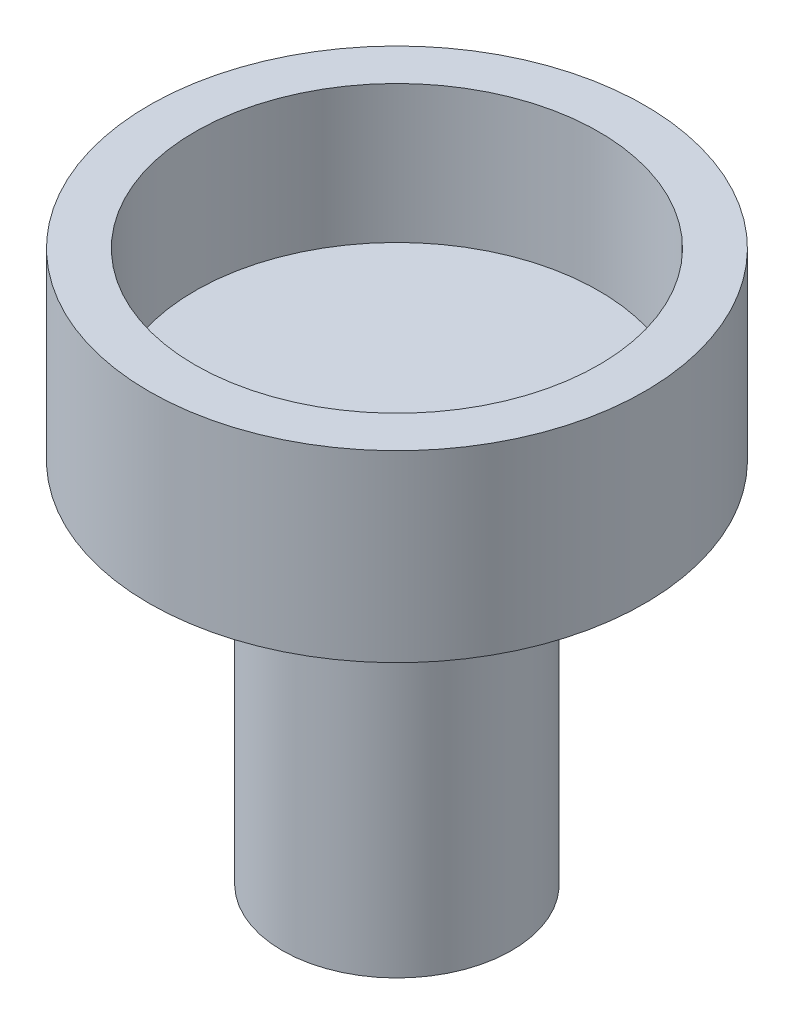
ISO-10303-21;
HEADER;
FILE_DESCRIPTION(('STEP AP214'),'2;1');
FILE_NAME('part.step','',(''),(''),'','','');
FILE_SCHEMA(('AUTOMOTIVE_DESIGN { 1 0 10303 214 1 1 1 1 }'));
ENDSEC;
DATA;
#1=APPLICATION_CONTEXT('core data for automotive mechanical design processes');
#2=APPLICATION_PROTOCOL_DEFINITION('international standard','automotive_design',2000,#1);
#3=PRODUCT_CONTEXT('',#1,'mechanical');
#4=PRODUCT('Part','Part','',(#3));
#5=PRODUCT_RELATED_PRODUCT_CATEGORY('part','',(#4));
#6=PRODUCT_DEFINITION_FORMATION('','',#4);
#7=PRODUCT_DEFINITION_CONTEXT('part definition',#1,'design');
#8=PRODUCT_DEFINITION('design','',#6,#7);
#9=PRODUCT_DEFINITION_SHAPE('','',#8);
#10=(LENGTH_UNIT() NAMED_UNIT(*) SI_UNIT(.MILLI.,.METRE.));
#11=(NAMED_UNIT(*) PLANE_ANGLE_UNIT() SI_UNIT($,.RADIAN.));
#12=(NAMED_UNIT(*) SI_UNIT($,.STERADIAN.) SOLID_ANGLE_UNIT());
#13=UNCERTAINTY_MEASURE_WITH_UNIT(LENGTH_MEASURE(1.E-05),#10,'distance_accuracy_value','');
#14=(GEOMETRIC_REPRESENTATION_CONTEXT(3) GLOBAL_UNCERTAINTY_ASSIGNED_CONTEXT((#13)) GLOBAL_UNIT_ASSIGNED_CONTEXT((#10,
#11,#12)) REPRESENTATION_CONTEXT('',''));
#15=CARTESIAN_POINT('',(0.,0.,0.));
#16=DIRECTION('',(0.,0.,1.));
#17=DIRECTION('',(1.,0.,0.));
#18=AXIS2_PLACEMENT_3D('',#15,#16,#17);
#19=CARTESIAN_POINT('',(0.,-4.,0.));
#20=DIRECTION('',(0.,1.,0.));
#21=DIRECTION('',(0.,0.,1.));
#22=AXIS2_PLACEMENT_3D('',#19,#20,#21);
#23=CYLINDRICAL_SURFACE('',#22,1.25);
#24=CARTESIAN_POINT('',(0.,-4.,0.));
#25=DIRECTION('',(0.,1.,0.));
#26=DIRECTION('',(0.,0.,1.));
#27=AXIS2_PLACEMENT_3D('',#24,#25,#26);
#28=CIRCLE('',#27,1.25);
#29=CARTESIAN_POINT('',(0.,-4.,1.25));
#30=VERTEX_POINT('',#29);
#31=EDGE_CURVE('E38',#30,#30,#28,.T.);
#32=ORIENTED_EDGE('',*,*,#31,.T.);
#33=EDGE_LOOP('',(#32));
#34=FACE_BOUND('',#33,.T.);
#35=CARTESIAN_POINT('',(0.,0.,0.));
#36=DIRECTION('',(0.,1.,0.));
#37=DIRECTION('',(0.,0.,1.));
#38=AXIS2_PLACEMENT_3D('',#35,#36,#37);
#39=CIRCLE('',#38,1.25);
#40=CARTESIAN_POINT('',(0.,0.,1.25));
#41=VERTEX_POINT('',#40);
#42=EDGE_CURVE('E42',#41,#41,#39,.T.);
#43=ORIENTED_EDGE('',*,*,#42,.F.);
#44=EDGE_LOOP('',(#43));
#45=FACE_BOUND('',#44,.T.);
#46=ADVANCED_FACE('F32',(#34,#45),#23,.T.);
#47=CARTESIAN_POINT('',(0.,-4.,0.));
#48=DIRECTION('',(0.,1.,0.));
#49=DIRECTION('',(0.,0.,1.));
#50=AXIS2_PLACEMENT_3D('',#47,#48,#49);
#51=PLANE('',#50);
#52=ORIENTED_EDGE('',*,*,#31,.F.);
#53=EDGE_LOOP('',(#52));
#54=FACE_BOUND('',#53,.T.);
#55=ADVANCED_FACE('F63',(#54),#51,.F.);
#56=CARTESIAN_POINT('',(0.,0.5,0.));
#57=DIRECTION('',(0.,-1.,0.));
#58=DIRECTION('',(0.,0.,-1.));
#59=AXIS2_PLACEMENT_3D('',#56,#57,#58);
#60=CYLINDRICAL_SURFACE('',#59,2.7);
#61=CARTESIAN_POINT('',(0.,0.,0.));
#62=DIRECTION('',(0.,1.,0.));
#63=DIRECTION('',(0.,0.,1.));
#64=AXIS2_PLACEMENT_3D('',#61,#62,#63);
#65=CIRCLE('',#64,2.7);
#66=CARTESIAN_POINT('',(0.,0.,2.7));
#67=VERTEX_POINT('',#66);
#68=EDGE_CURVE('E47',#67,#67,#65,.T.);
#69=ORIENTED_EDGE('',*,*,#68,.T.);
#70=EDGE_LOOP('',(#69));
#71=FACE_BOUND('',#70,.T.);
#72=CARTESIAN_POINT('',(0.,2.,0.));
#73=DIRECTION('',(0.,1.,0.));
#74=DIRECTION('',(0.,0.,1.));
#75=AXIS2_PLACEMENT_3D('',#72,#73,#74);
#76=CIRCLE('',#75,2.7);
#77=CARTESIAN_POINT('',(0.,2.,2.7));
#78=VERTEX_POINT('',#77);
#79=EDGE_CURVE('E51',#78,#78,#76,.T.);
#80=ORIENTED_EDGE('',*,*,#79,.F.);
#81=EDGE_LOOP('',(#80));
#82=FACE_BOUND('',#81,.T.);
#83=ADVANCED_FACE('F60',(#71,#82),#60,.T.);
#84=CARTESIAN_POINT('',(0.,0.,0.));
#85=DIRECTION('',(0.,1.,0.));
#86=DIRECTION('',(0.,0.,1.));
#87=AXIS2_PLACEMENT_3D('',#84,#85,#86);
#88=PLANE('',#87);
#89=ORIENTED_EDGE('',*,*,#42,.T.);
#90=EDGE_LOOP('',(#89));
#91=FACE_BOUND('',#90,.T.);
#92=ORIENTED_EDGE('',*,*,#68,.F.);
#93=EDGE_LOOP('',(#92));
#94=FACE_BOUND('',#93,.T.);
#95=ADVANCED_FACE('F62',(#91,#94),#88,.F.);
#96=CARTESIAN_POINT('',(0.,11.6367532368147,0.));
#97=DIRECTION('',(0.,-1.,0.));
#98=DIRECTION('',(0.,0.,-1.));
#99=AXIS2_PLACEMENT_3D('',#96,#97,#98);
#100=CYLINDRICAL_SURFACE('',#99,2.2);
#101=CARTESIAN_POINT('',(0.,0.5,0.));
#102=DIRECTION('',(0.,1.,0.));
#103=DIRECTION('',(0.,0.,1.));
#104=AXIS2_PLACEMENT_3D('',#101,#102,#103);
#105=CIRCLE('',#104,2.2);
#106=CARTESIAN_POINT('',(0.,0.5,2.2));
#107=VERTEX_POINT('',#106);
#108=EDGE_CURVE('E11',#107,#107,#105,.F.);
#109=ORIENTED_EDGE('',*,*,#108,.T.);
#110=EDGE_LOOP('',(#109));
#111=FACE_BOUND('',#110,.T.);
#112=CARTESIAN_POINT('',(0.,2.,0.));
#113=DIRECTION('',(0.,1.,0.));
#114=DIRECTION('',(0.,0.,1.));
#115=AXIS2_PLACEMENT_3D('',#112,#113,#114);
#116=CIRCLE('',#115,2.2);
#117=CARTESIAN_POINT('',(0.,2.,2.2));
#118=VERTEX_POINT('',#117);
#119=EDGE_CURVE('E52',#118,#118,#116,.T.);
#120=ORIENTED_EDGE('',*,*,#119,.T.);
#121=EDGE_LOOP('',(#120));
#122=FACE_BOUND('',#121,.T.);
#123=ADVANCED_FACE('F70',(#111,#122),#100,.F.);
#124=CARTESIAN_POINT('',(0.,2.,0.));
#125=DIRECTION('',(0.,1.,0.));
#126=DIRECTION('',(0.,0.,1.));
#127=AXIS2_PLACEMENT_3D('',#124,#125,#126);
#128=PLANE('',#127);
#129=ORIENTED_EDGE('',*,*,#119,.F.);
#130=EDGE_LOOP('',(#129));
#131=FACE_BOUND('',#130,.T.);
#132=ORIENTED_EDGE('',*,*,#79,.T.);
#133=EDGE_LOOP('',(#132));
#134=FACE_BOUND('',#133,.T.);
#135=ADVANCED_FACE('F58',(#131,#134),#128,.T.);
#136=CARTESIAN_POINT('',(0.,0.5,0.));
#137=DIRECTION('',(0.,1.,0.));
#138=DIRECTION('',(0.,0.,1.));
#139=AXIS2_PLACEMENT_3D('',#136,#137,#138);
#140=PLANE('',#139);
#141=ORIENTED_EDGE('',*,*,#108,.F.);
#142=EDGE_LOOP('',(#141));
#143=FACE_BOUND('',#142,.T.);
#144=ADVANCED_FACE('F114',(#143),#140,.T.);
#145=CLOSED_SHELL('',(#46,#55,#83,#95,#123,#135,#144));
#146=MANIFOLD_SOLID_BREP('B2',#145);
#147=ADVANCED_BREP_SHAPE_REPRESENTATION('',(#18,#146),#14);
#148=SHAPE_DEFINITION_REPRESENTATION(#9,#147);
ENDSEC;
END-ISO-10303-21;
